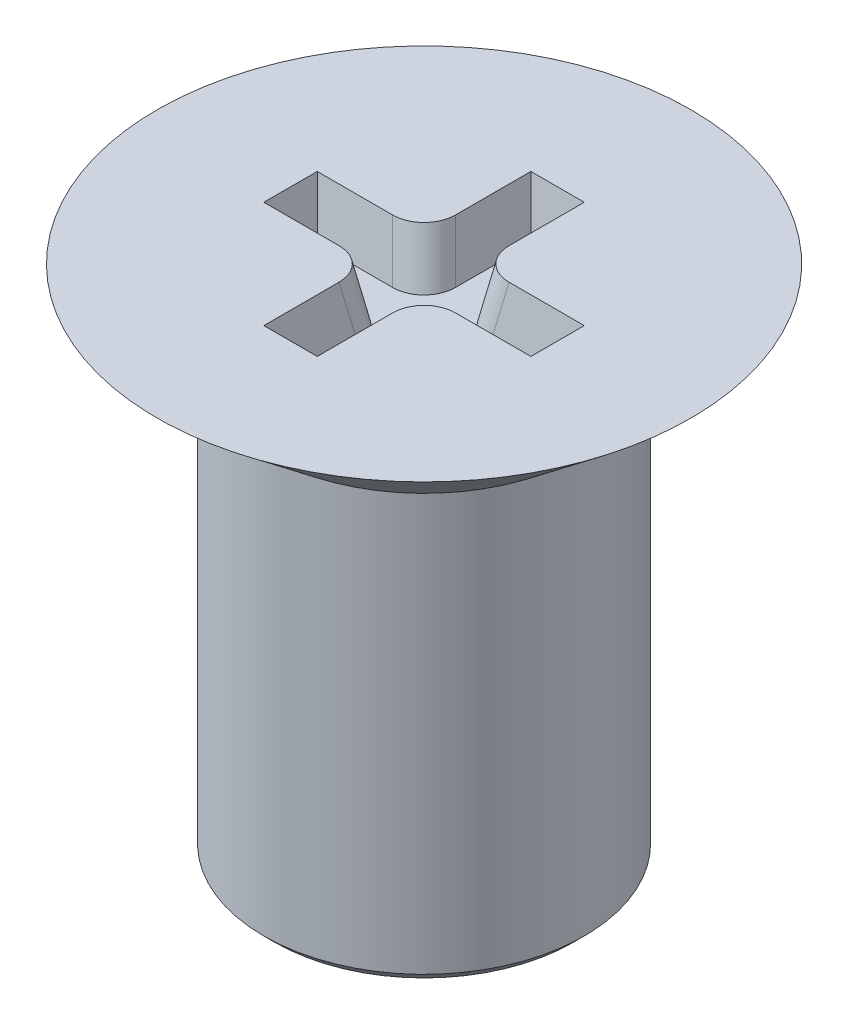
ISO-10303-21;
HEADER;
FILE_DESCRIPTION(('STEP AP214'),'2;1');
FILE_NAME('part.step','',(''),(''),'','','');
FILE_SCHEMA(('AUTOMOTIVE_DESIGN { 1 0 10303 214 1 1 1 1 }'));
ENDSEC;
DATA;
#1=APPLICATION_CONTEXT('core data for automotive mechanical design processes');
#2=APPLICATION_PROTOCOL_DEFINITION('international standard','automotive_design',2000,#1);
#3=PRODUCT_CONTEXT('',#1,'mechanical');
#4=PRODUCT('Part','Part','',(#3));
#5=PRODUCT_RELATED_PRODUCT_CATEGORY('part','',(#4));
#6=PRODUCT_DEFINITION_FORMATION('','',#4);
#7=PRODUCT_DEFINITION_CONTEXT('part definition',#1,'design');
#8=PRODUCT_DEFINITION('design','',#6,#7);
#9=PRODUCT_DEFINITION_SHAPE('','',#8);
#10=(LENGTH_UNIT() NAMED_UNIT(*) SI_UNIT(.MILLI.,.METRE.));
#11=(NAMED_UNIT(*) PLANE_ANGLE_UNIT() SI_UNIT($,.RADIAN.));
#12=(NAMED_UNIT(*) SI_UNIT($,.STERADIAN.) SOLID_ANGLE_UNIT());
#13=UNCERTAINTY_MEASURE_WITH_UNIT(LENGTH_MEASURE(1.E-05),#10,'distance_accuracy_value','');
#14=(GEOMETRIC_REPRESENTATION_CONTEXT(3) GLOBAL_UNCERTAINTY_ASSIGNED_CONTEXT((#13)) GLOBAL_UNIT_ASSIGNED_CONTEXT((#10,
#11,#12)) REPRESENTATION_CONTEXT('',''));
#15=CARTESIAN_POINT('',(0.,0.,0.));
#16=DIRECTION('',(0.,0.,1.));
#17=DIRECTION('',(1.,0.,0.));
#18=AXIS2_PLACEMENT_3D('',#15,#16,#17);
#19=CARTESIAN_POINT('',(0.,0.,0.));
#20=DIRECTION('',(0.,1.,0.));
#21=DIRECTION('',(0.,0.,1.));
#22=AXIS2_PLACEMENT_3D('',#19,#20,#21);
#23=PLANE('',#22);
#24=CARTESIAN_POINT('',(0.,0.,0.));
#25=DIRECTION('',(0.,-1.,0.));
#26=DIRECTION('',(0.,0.,-1.));
#27=AXIS2_PLACEMENT_3D('',#24,#25,#26);
#28=CIRCLE('',#27,2.5);
#29=CARTESIAN_POINT('',(0.,0.,-2.5));
#30=VERTEX_POINT('',#29);
#31=EDGE_CURVE('E254',#30,#30,#28,.T.);
#32=ORIENTED_EDGE('',*,*,#31,.F.);
#33=EDGE_LOOP('',(#32));
#34=FACE_BOUND('',#33,.T.);
#35=DIRECTION('',(1.,0.,0.));
#36=VECTOR('',#35,1.);
#37=CARTESIAN_POINT('',(0.,0.,-0.25));
#38=LINE('',#37,#36);
#39=CARTESIAN_POINT('',(-1.25,0.,-0.25));
#40=VERTEX_POINT('',#39);
#41=CARTESIAN_POINT('',(-0.545442325903662,0.,-0.25));
#42=VERTEX_POINT('',#41);
#43=EDGE_CURVE('E184',#40,#42,#38,.T.);
#44=ORIENTED_EDGE('',*,*,#43,.T.);
#45=CARTESIAN_POINT('',(-0.554627983565723,0.,-0.554627983565723));
#46=DIRECTION('',(0.,1.,0.));
#47=DIRECTION('',(-0.707106781186548,0.,-0.707106781186547));
#48=AXIS2_PLACEMENT_3D('',#45,#46,#47);
#49=ELLIPSE('',#48,0.309186702079241,0.3);
#50=CARTESIAN_POINT('',(-0.25,0.,-0.545442325903662));
#51=VERTEX_POINT('',#50);
#52=EDGE_CURVE('E272',#42,#51,#49,.T.);
#53=ORIENTED_EDGE('',*,*,#52,.T.);
#54=DIRECTION('',(0.,0.,1.));
#55=VECTOR('',#54,1.);
#56=CARTESIAN_POINT('',(-0.25,0.,0.));
#57=LINE('',#56,#55);
#58=CARTESIAN_POINT('',(-0.25,0.,-1.25));
#59=VERTEX_POINT('',#58);
#60=EDGE_CURVE('E182',#59,#51,#57,.T.);
#61=ORIENTED_EDGE('',*,*,#60,.F.);
#62=DIRECTION('',(1.,0.,0.));
#63=VECTOR('',#62,1.);
#64=CARTESIAN_POINT('',(0.,0.,-1.25));
#65=LINE('',#64,#63);
#66=CARTESIAN_POINT('',(0.25,0.,-1.25));
#67=VERTEX_POINT('',#66);
#68=EDGE_CURVE('E161',#59,#67,#65,.T.);
#69=ORIENTED_EDGE('',*,*,#68,.T.);
#70=DIRECTION('',(0.,0.,1.));
#71=VECTOR('',#70,1.);
#72=CARTESIAN_POINT('',(0.25,0.,0.));
#73=LINE('',#72,#71);
#74=CARTESIAN_POINT('',(0.25,0.,-0.545442325903662));
#75=VERTEX_POINT('',#74);
#76=EDGE_CURVE('E173',#67,#75,#73,.T.);
#77=ORIENTED_EDGE('',*,*,#76,.T.);
#78=CARTESIAN_POINT('',(0.554627983565724,0.,-0.554627983565723));
#79=DIRECTION('',(0.,1.,0.));
#80=DIRECTION('',(0.707106781186547,0.,-0.707106781186548));
#81=AXIS2_PLACEMENT_3D('',#78,#79,#80);
#82=ELLIPSE('',#81,0.309186702079241,0.3);
#83=CARTESIAN_POINT('',(0.545442325903663,0.,-0.25));
#84=VERTEX_POINT('',#83);
#85=EDGE_CURVE('E270',#75,#84,#82,.T.);
#86=ORIENTED_EDGE('',*,*,#85,.T.);
#87=DIRECTION('',(1.,0.,0.));
#88=VECTOR('',#87,1.);
#89=CARTESIAN_POINT('',(0.,0.,-0.25));
#90=LINE('',#89,#88);
#91=CARTESIAN_POINT('',(1.25,0.,-0.25));
#92=VERTEX_POINT('',#91);
#93=EDGE_CURVE('E178',#84,#92,#90,.T.);
#94=ORIENTED_EDGE('',*,*,#93,.T.);
#95=DIRECTION('',(0.,0.,-1.));
#96=VECTOR('',#95,1.);
#97=CARTESIAN_POINT('',(1.25,0.,0.));
#98=LINE('',#97,#96);
#99=CARTESIAN_POINT('',(1.25,0.,0.25));
#100=VERTEX_POINT('',#99);
#101=EDGE_CURVE('E204',#100,#92,#98,.T.);
#102=ORIENTED_EDGE('',*,*,#101,.F.);
#103=DIRECTION('',(1.,0.,0.));
#104=VECTOR('',#103,1.);
#105=CARTESIAN_POINT('',(0.,0.,0.25));
#106=LINE('',#105,#104);
#107=CARTESIAN_POINT('',(0.545442325903663,0.,0.25));
#108=VERTEX_POINT('',#107);
#109=EDGE_CURVE('E202',#108,#100,#106,.T.);
#110=ORIENTED_EDGE('',*,*,#109,.F.);
#111=CARTESIAN_POINT('',(0.554627983565724,0.,0.554627983565724));
#112=DIRECTION('',(0.,1.,0.));
#113=DIRECTION('',(0.707106781186548,0.,0.707106781186547));
#114=AXIS2_PLACEMENT_3D('',#111,#112,#113);
#115=ELLIPSE('',#114,0.309186702079241,0.3);
#116=CARTESIAN_POINT('',(0.25,0.,0.545442325903663));
#117=VERTEX_POINT('',#116);
#118=EDGE_CURVE('E266',#108,#117,#115,.T.);
#119=ORIENTED_EDGE('',*,*,#118,.T.);
#120=DIRECTION('',(0.,0.,1.));
#121=VECTOR('',#120,1.);
#122=CARTESIAN_POINT('',(0.25,0.,0.));
#123=LINE('',#122,#121);
#124=CARTESIAN_POINT('',(0.250000000000001,0.,1.25));
#125=VERTEX_POINT('',#124);
#126=EDGE_CURVE('E200',#117,#125,#123,.T.);
#127=ORIENTED_EDGE('',*,*,#126,.T.);
#128=DIRECTION('',(1.,0.,0.));
#129=VECTOR('',#128,1.);
#130=CARTESIAN_POINT('',(0.,0.,1.25));
#131=LINE('',#130,#129);
#132=CARTESIAN_POINT('',(-0.249999999999999,0.,1.25));
#133=VERTEX_POINT('',#132);
#134=EDGE_CURVE('E197',#133,#125,#131,.T.);
#135=ORIENTED_EDGE('',*,*,#134,.F.);
#136=DIRECTION('',(0.,0.,1.));
#137=VECTOR('',#136,1.);
#138=CARTESIAN_POINT('',(-0.25,0.,0.));
#139=LINE('',#138,#137);
#140=CARTESIAN_POINT('',(-0.25,0.,0.545442325903662));
#141=VERTEX_POINT('',#140);
#142=EDGE_CURVE('E195',#141,#133,#139,.T.);
#143=ORIENTED_EDGE('',*,*,#142,.F.);
#144=CARTESIAN_POINT('',(-0.554627983565723,0.,0.554627983565724));
#145=DIRECTION('',(0.,1.,0.));
#146=DIRECTION('',(-0.707106781186547,0.,0.707106781186548));
#147=AXIS2_PLACEMENT_3D('',#144,#145,#146);
#148=ELLIPSE('',#147,0.309186702079241,0.3);
#149=CARTESIAN_POINT('',(-0.545442325903662,0.,0.25));
#150=VERTEX_POINT('',#149);
#151=EDGE_CURVE('E268',#141,#150,#148,.T.);
#152=ORIENTED_EDGE('',*,*,#151,.T.);
#153=DIRECTION('',(1.,0.,0.));
#154=VECTOR('',#153,1.);
#155=CARTESIAN_POINT('',(0.,0.,0.25));
#156=LINE('',#155,#154);
#157=CARTESIAN_POINT('',(-1.25,0.,0.25));
#158=VERTEX_POINT('',#157);
#159=EDGE_CURVE('E192',#158,#150,#156,.T.);
#160=ORIENTED_EDGE('',*,*,#159,.F.);
#161=DIRECTION('',(0.,0.,-1.));
#162=VECTOR('',#161,1.);
#163=CARTESIAN_POINT('',(-1.25,0.,0.));
#164=LINE('',#163,#162);
#165=EDGE_CURVE('E189',#158,#40,#164,.T.);
#166=ORIENTED_EDGE('',*,*,#165,.T.);
#167=EDGE_LOOP('',(#44,#53,#61,#69,#77,#86,#94,#102,#110,#119,#127,#135,#143,#152,#160,#166));
#168=FACE_BOUND('',#167,.T.);
#169=ADVANCED_FACE('F45',(#34,#168),#23,.T.);
#170=CARTESIAN_POINT('',(0.,-0.8,0.));
#171=DIRECTION('',(0.,1.,0.));
#172=DIRECTION('',(0.,0.,1.));
#173=AXIS2_PLACEMENT_3D('',#170,#171,#172);
#174=CONICAL_SURFACE('',#173,1.5,0.896055384571344);
#175=ORIENTED_EDGE('',*,*,#31,.T.);
#176=EDGE_LOOP('',(#175));
#177=FACE_BOUND('',#176,.T.);
#178=CARTESIAN_POINT('',(0.,-0.8,0.));
#179=DIRECTION('',(0.,-1.,0.));
#180=DIRECTION('',(0.,0.,-1.));
#181=AXIS2_PLACEMENT_3D('',#178,#179,#180);
#182=CIRCLE('',#181,1.5);
#183=CARTESIAN_POINT('',(0.,-0.8,-1.5));
#184=VERTEX_POINT('',#183);
#185=EDGE_CURVE('E210',#184,#184,#182,.T.);
#186=ORIENTED_EDGE('',*,*,#185,.F.);
#187=EDGE_LOOP('',(#186));
#188=FACE_BOUND('',#187,.T.);
#189=ADVANCED_FACE('F349',(#177,#188),#174,.T.);
#190=CARTESIAN_POINT('',(0.,-4.8,0.));
#191=DIRECTION('',(0.,1.,0.));
#192=DIRECTION('',(0.,0.,1.));
#193=AXIS2_PLACEMENT_3D('',#190,#191,#192);
#194=CYLINDRICAL_SURFACE('',#193,1.5);
#195=CARTESIAN_POINT('',(0.,-4.7,0.));
#196=DIRECTION('',(0.,-1.,0.));
#197=DIRECTION('',(0.,0.,-1.));
#198=AXIS2_PLACEMENT_3D('',#195,#196,#197);
#199=CIRCLE('',#198,1.5);
#200=CARTESIAN_POINT('',(0.,-4.7,-1.5));
#201=VERTEX_POINT('',#200);
#202=EDGE_CURVE('E260',#201,#201,#199,.F.);
#203=ORIENTED_EDGE('',*,*,#202,.T.);
#204=EDGE_LOOP('',(#203));
#205=FACE_BOUND('',#204,.T.);
#206=ORIENTED_EDGE('',*,*,#185,.T.);
#207=EDGE_LOOP('',(#206));
#208=FACE_BOUND('',#207,.T.);
#209=ADVANCED_FACE('F357',(#205,#208),#194,.T.);
#210=CARTESIAN_POINT('',(0.,-4.8,0.));
#211=DIRECTION('',(0.,-1.,0.));
#212=DIRECTION('',(0.,0.,-1.));
#213=AXIS2_PLACEMENT_3D('',#210,#211,#212);
#214=PLANE('',#213);
#215=CARTESIAN_POINT('',(0.,-4.8,0.));
#216=DIRECTION('',(0.,-1.,0.));
#217=DIRECTION('',(0.,0.,-1.));
#218=AXIS2_PLACEMENT_3D('',#215,#216,#217);
#219=CIRCLE('',#218,1.4);
#220=CARTESIAN_POINT('',(0.,-4.8,-1.4));
#221=VERTEX_POINT('',#220);
#222=EDGE_CURVE('E257',#221,#221,#219,.T.);
#223=ORIENTED_EDGE('',*,*,#222,.T.);
#224=EDGE_LOOP('',(#223));
#225=FACE_BOUND('',#224,.T.);
#226=ADVANCED_FACE('F369',(#225),#214,.T.);
#227=CARTESIAN_POINT('',(0.,-4.8,0.));
#228=DIRECTION('',(0.,1.,0.));
#229=DIRECTION('',(0.,0.,1.));
#230=AXIS2_PLACEMENT_3D('',#227,#228,#229);
#231=CONICAL_SURFACE('',#230,1.4,0.785398163397448);
#232=ORIENTED_EDGE('',*,*,#202,.F.);
#233=EDGE_LOOP('',(#232));
#234=FACE_BOUND('',#233,.T.);
#235=ORIENTED_EDGE('',*,*,#222,.F.);
#236=EDGE_LOOP('',(#235));
#237=FACE_BOUND('',#236,.T.);
#238=ADVANCED_FACE('F364',(#234,#237),#231,.T.);
#239=CARTESIAN_POINT('',(0.,0.,-0.25));
#240=DIRECTION('',(0.,-0.17364817766693,-0.984807753012208));
#241=DIRECTION('',(0.,0.984807753012208,-0.17364817766693));
#242=AXIS2_PLACEMENT_3D('',#239,#240,#241);
#243=PLANE('',#242);
#244=ORIENTED_EDGE('',*,*,#93,.F.);
#245=DIRECTION('',(-0.171087869746036,-0.970287525247814,0.171087869746036));
#246=VECTOR('',#245,1.);
#247=CARTESIAN_POINT('',(0.529476651306003,-0.0905458400836372,-0.234034325402341));
#248=LINE('',#247,#246);
#249=CARTESIAN_POINT('',(0.45727883554943,-0.5,-0.161836509645767));
#250=VERTEX_POINT('',#249);
#251=EDGE_CURVE('E277',#84,#250,#248,.T.);
#252=ORIENTED_EDGE('',*,*,#251,.T.);
#253=DIRECTION('',(-1.,0.,0.));
#254=VECTOR('',#253,1.);
#255=CARTESIAN_POINT('',(0.,-0.5,-0.161836509645767));
#256=LINE('',#255,#254);
#257=CARTESIAN_POINT('',(1.16183650964577,-0.5,-0.161836509645767));
#258=VERTEX_POINT('',#257);
#259=EDGE_CURVE('E207',#250,#258,#256,.F.);
#260=ORIENTED_EDGE('',*,*,#259,.T.);
#261=DIRECTION('',(-0.171087869746036,-0.970287525247814,0.171087869746036));
#262=VECTOR('',#261,1.);
#263=CARTESIAN_POINT('',(1.2134111760322,-0.207505532169751,-0.213411176032204));
#264=LINE('',#263,#262);
#265=EDGE_CURVE('E208',#258,#92,#264,.F.);
#266=ORIENTED_EDGE('',*,*,#265,.T.);
#267=EDGE_LOOP('',(#244,#252,#260,#266));
#268=FACE_BOUND('',#267,.T.);
#269=ADVANCED_FACE('F333',(#268),#243,.F.);
#270=CARTESIAN_POINT('',(1.25,0.,0.));
#271=DIRECTION('',(0.984807753012208,-0.17364817766693,0.));
#272=DIRECTION('',(0.17364817766693,0.984807753012208,0.));
#273=AXIS2_PLACEMENT_3D('',#270,#271,#272);
#274=PLANE('',#273);
#275=ORIENTED_EDGE('',*,*,#101,.T.);
#276=ORIENTED_EDGE('',*,*,#265,.F.);
#277=DIRECTION('',(0.,0.,-1.));
#278=VECTOR('',#277,1.);
#279=CARTESIAN_POINT('',(1.16183650964577,-0.5,0.));
#280=LINE('',#279,#278);
#281=CARTESIAN_POINT('',(1.16183650964577,-0.5,0.161836509645768));
#282=VERTEX_POINT('',#281);
#283=EDGE_CURVE('E169',#282,#258,#280,.T.);
#284=ORIENTED_EDGE('',*,*,#283,.F.);
#285=DIRECTION('',(0.171087869746036,0.970287525247814,0.171087869746036));
#286=VECTOR('',#285,1.);
#287=CARTESIAN_POINT('',(1.2134111760322,-0.207505532169751,0.213411176032205));
#288=LINE('',#287,#286);
#289=EDGE_CURVE('E211',#282,#100,#288,.T.);
#290=ORIENTED_EDGE('',*,*,#289,.T.);
#291=EDGE_LOOP('',(#275,#276,#284,#290));
#292=FACE_BOUND('',#291,.T.);
#293=ADVANCED_FACE('F337',(#292),#274,.F.);
#294=CARTESIAN_POINT('',(0.,0.,0.25));
#295=DIRECTION('',(0.,-0.17364817766693,0.984807753012208));
#296=DIRECTION('',(0.,-0.984807753012208,-0.17364817766693));
#297=AXIS2_PLACEMENT_3D('',#294,#295,#296);
#298=PLANE('',#297);
#299=DIRECTION('',(1.,0.,0.));
#300=VECTOR('',#299,1.);
#301=CARTESIAN_POINT('',(0.,-0.5,0.161836509645768));
#302=LINE('',#301,#300);
#303=CARTESIAN_POINT('',(0.45727883554943,-0.5,0.161836509645768));
#304=VERTEX_POINT('',#303);
#305=EDGE_CURVE('E230',#304,#282,#302,.T.);
#306=ORIENTED_EDGE('',*,*,#305,.F.);
#307=DIRECTION('',(-0.171087869746036,-0.970287525247814,-0.171087869746036));
#308=VECTOR('',#307,1.);
#309=CARTESIAN_POINT('',(0.536794416099563,-0.049044733649687,0.2413520901959));
#310=LINE('',#309,#308);
#311=EDGE_CURVE('E284',#304,#108,#310,.F.);
#312=ORIENTED_EDGE('',*,*,#311,.T.);
#313=ORIENTED_EDGE('',*,*,#109,.T.);
#314=ORIENTED_EDGE('',*,*,#289,.F.);
#315=EDGE_LOOP('',(#306,#312,#313,#314));
#316=FACE_BOUND('',#315,.T.);
#317=ADVANCED_FACE('F341',(#316),#298,.F.);
#318=CARTESIAN_POINT('',(0.25,0.,0.));
#319=DIRECTION('',(0.984807753012208,-0.17364817766693,0.));
#320=DIRECTION('',(0.17364817766693,0.984807753012208,0.));
#321=AXIS2_PLACEMENT_3D('',#318,#319,#320);
#322=PLANE('',#321);
#323=ORIENTED_EDGE('',*,*,#126,.F.);
#324=DIRECTION('',(0.171087869746036,0.970287525247814,0.171087869746036));
#325=VECTOR('',#324,1.);
#326=CARTESIAN_POINT('',(0.153188599841668,-0.549044733649687,0.44863092574533));
#327=LINE('',#326,#325);
#328=CARTESIAN_POINT('',(0.161836509645768,-0.5,0.45727883554943));
#329=VERTEX_POINT('',#328);
#330=EDGE_CURVE('E60',#117,#329,#327,.F.);
#331=ORIENTED_EDGE('',*,*,#330,.T.);
#332=DIRECTION('',(0.,0.,-1.));
#333=VECTOR('',#332,1.);
#334=CARTESIAN_POINT('',(0.161836509645768,-0.5,0.));
#335=LINE('',#334,#333);
#336=CARTESIAN_POINT('',(0.161836509645768,-0.5,1.16183650964577));
#337=VERTEX_POINT('',#336);
#338=EDGE_CURVE('E232',#329,#337,#335,.F.);
#339=ORIENTED_EDGE('',*,*,#338,.T.);
#340=DIRECTION('',(-0.171087869746036,-0.970287525247814,-0.171087869746036));
#341=VECTOR('',#340,1.);
#342=CARTESIAN_POINT('',(0.213411176032205,-0.207505532169751,1.2134111760322));
#343=LINE('',#342,#341);
#344=EDGE_CURVE('E221',#337,#125,#343,.F.);
#345=ORIENTED_EDGE('',*,*,#344,.T.);
#346=EDGE_LOOP('',(#323,#331,#339,#345));
#347=FACE_BOUND('',#346,.T.);
#348=ADVANCED_FACE('F459',(#347),#322,.F.);
#349=CARTESIAN_POINT('',(0.,0.,1.25));
#350=DIRECTION('',(0.,-0.17364817766693,0.984807753012208));
#351=DIRECTION('',(0.,-0.984807753012208,-0.17364817766693));
#352=AXIS2_PLACEMENT_3D('',#349,#350,#351);
#353=PLANE('',#352);
#354=ORIENTED_EDGE('',*,*,#134,.T.);
#355=ORIENTED_EDGE('',*,*,#344,.F.);
#356=DIRECTION('',(1.,0.,0.));
#357=VECTOR('',#356,1.);
#358=CARTESIAN_POINT('',(0.,-0.5,1.16183650964577));
#359=LINE('',#358,#357);
#360=CARTESIAN_POINT('',(-0.161836509645767,-0.5,1.16183650964577));
#361=VERTEX_POINT('',#360);
#362=EDGE_CURVE('E234',#361,#337,#359,.T.);
#363=ORIENTED_EDGE('',*,*,#362,.F.);
#364=DIRECTION('',(-0.171087869746036,0.970287525247814,0.171087869746036));
#365=VECTOR('',#364,1.);
#366=CARTESIAN_POINT('',(-0.213411176032204,-0.207505532169751,1.2134111760322));
#367=LINE('',#366,#365);
#368=EDGE_CURVE('E218',#361,#133,#367,.T.);
#369=ORIENTED_EDGE('',*,*,#368,.T.);
#370=EDGE_LOOP('',(#354,#355,#363,#369));
#371=FACE_BOUND('',#370,.T.);
#372=ADVANCED_FACE('F451',(#371),#353,.F.);
#373=CARTESIAN_POINT('',(-0.25,0.,0.));
#374=DIRECTION('',(-0.984807753012208,-0.17364817766693,0.));
#375=DIRECTION('',(0.17364817766693,-0.984807753012208,0.));
#376=AXIS2_PLACEMENT_3D('',#373,#374,#375);
#377=PLANE('',#376);
#378=DIRECTION('',(0.,0.,1.));
#379=VECTOR('',#378,1.);
#380=CARTESIAN_POINT('',(-0.161836509645767,-0.5,0.));
#381=LINE('',#380,#379);
#382=CARTESIAN_POINT('',(-0.161836509645767,-0.5,0.45727883554943));
#383=VERTEX_POINT('',#382);
#384=EDGE_CURVE('E237',#383,#361,#381,.T.);
#385=ORIENTED_EDGE('',*,*,#384,.F.);
#386=DIRECTION('',(-0.171087869746036,0.970287525247814,0.171087869746036));
#387=VECTOR('',#386,1.);
#388=CARTESIAN_POINT('',(-0.23403432540234,-0.0905458400836372,0.529476651306003));
#389=LINE('',#388,#387);
#390=EDGE_CURVE('E279',#383,#141,#389,.T.);
#391=ORIENTED_EDGE('',*,*,#390,.T.);
#392=ORIENTED_EDGE('',*,*,#142,.T.);
#393=ORIENTED_EDGE('',*,*,#368,.F.);
#394=EDGE_LOOP('',(#385,#391,#392,#393));
#395=FACE_BOUND('',#394,.T.);
#396=ADVANCED_FACE('F302',(#395),#377,.F.);
#397=CARTESIAN_POINT('',(0.,0.,0.25));
#398=DIRECTION('',(0.,-0.17364817766693,0.984807753012208));
#399=DIRECTION('',(0.,-0.984807753012208,-0.17364817766693));
#400=AXIS2_PLACEMENT_3D('',#397,#398,#399);
#401=PLANE('',#400);
#402=ORIENTED_EDGE('',*,*,#159,.T.);
#403=DIRECTION('',(-0.171087869746036,0.970287525247814,0.171087869746036));
#404=VECTOR('',#403,1.);
#405=CARTESIAN_POINT('',(-0.529476651306003,-0.0905458400836371,0.234034325402341));
#406=LINE('',#405,#404);
#407=CARTESIAN_POINT('',(-0.457278835549429,-0.5,0.161836509645768));
#408=VERTEX_POINT('',#407);
#409=EDGE_CURVE('E282',#150,#408,#406,.F.);
#410=ORIENTED_EDGE('',*,*,#409,.T.);
#411=DIRECTION('',(1.,0.,0.));
#412=VECTOR('',#411,1.);
#413=CARTESIAN_POINT('',(0.,-0.5,0.161836509645768));
#414=LINE('',#413,#412);
#415=CARTESIAN_POINT('',(-1.16183650964577,-0.5,0.161836509645768));
#416=VERTEX_POINT('',#415);
#417=EDGE_CURVE('E239',#416,#408,#414,.T.);
#418=ORIENTED_EDGE('',*,*,#417,.F.);
#419=DIRECTION('',(0.171087869746036,-0.970287525247814,-0.171087869746036));
#420=VECTOR('',#419,1.);
#421=CARTESIAN_POINT('',(-1.2134111760322,-0.207505532169751,0.213411176032205));
#422=LINE('',#421,#420);
#423=EDGE_CURVE('E216',#416,#158,#422,.F.);
#424=ORIENTED_EDGE('',*,*,#423,.T.);
#425=EDGE_LOOP('',(#402,#410,#418,#424));
#426=FACE_BOUND('',#425,.T.);
#427=ADVANCED_FACE('F309',(#426),#401,.F.);
#428=CARTESIAN_POINT('',(-1.25,0.,0.));
#429=DIRECTION('',(-0.984807753012208,-0.17364817766693,0.));
#430=DIRECTION('',(0.17364817766693,-0.984807753012208,0.));
#431=AXIS2_PLACEMENT_3D('',#428,#429,#430);
#432=PLANE('',#431);
#433=ORIENTED_EDGE('',*,*,#165,.F.);
#434=ORIENTED_EDGE('',*,*,#423,.F.);
#435=DIRECTION('',(0.,0.,1.));
#436=VECTOR('',#435,1.);
#437=CARTESIAN_POINT('',(-1.16183650964577,-0.5,0.));
#438=LINE('',#437,#436);
#439=CARTESIAN_POINT('',(-1.16183650964577,-0.5,-0.161836509645767));
#440=VERTEX_POINT('',#439);
#441=EDGE_CURVE('E242',#416,#440,#438,.F.);
#442=ORIENTED_EDGE('',*,*,#441,.T.);
#443=DIRECTION('',(-0.171087869746036,0.970287525247814,-0.171087869746036));
#444=VECTOR('',#443,1.);
#445=CARTESIAN_POINT('',(-1.2134111760322,-0.207505532169751,-0.213411176032204));
#446=LINE('',#445,#444);
#447=EDGE_CURVE('E214',#440,#40,#446,.T.);
#448=ORIENTED_EDGE('',*,*,#447,.T.);
#449=EDGE_LOOP('',(#433,#434,#442,#448));
#450=FACE_BOUND('',#449,.T.);
#451=ADVANCED_FACE('F312',(#450),#432,.F.);
#452=CARTESIAN_POINT('',(0.,0.,-0.25));
#453=DIRECTION('',(0.,-0.17364817766693,-0.984807753012208));
#454=DIRECTION('',(0.,0.984807753012208,-0.17364817766693));
#455=AXIS2_PLACEMENT_3D('',#452,#453,#454);
#456=PLANE('',#455);
#457=DIRECTION('',(-1.,0.,0.));
#458=VECTOR('',#457,1.);
#459=CARTESIAN_POINT('',(0.,-0.5,-0.161836509645767));
#460=LINE('',#459,#458);
#461=CARTESIAN_POINT('',(-0.457278835549429,-0.5,-0.161836509645767));
#462=VERTEX_POINT('',#461);
#463=EDGE_CURVE('E244',#440,#462,#460,.F.);
#464=ORIENTED_EDGE('',*,*,#463,.T.);
#465=DIRECTION('',(-0.171087869746036,0.970287525247814,-0.171087869746036));
#466=VECTOR('',#465,1.);
#467=CARTESIAN_POINT('',(-0.536794416099562,-0.0490447336496869,-0.2413520901959));
#468=LINE('',#467,#466);
#469=EDGE_CURVE('E263',#462,#42,#468,.T.);
#470=ORIENTED_EDGE('',*,*,#469,.T.);
#471=ORIENTED_EDGE('',*,*,#43,.F.);
#472=ORIENTED_EDGE('',*,*,#447,.F.);
#473=EDGE_LOOP('',(#464,#470,#471,#472));
#474=FACE_BOUND('',#473,.T.);
#475=ADVANCED_FACE('F316',(#474),#456,.F.);
#476=CARTESIAN_POINT('',(-0.25,0.,0.));
#477=DIRECTION('',(-0.984807753012208,-0.17364817766693,0.));
#478=DIRECTION('',(0.17364817766693,-0.984807753012208,0.));
#479=AXIS2_PLACEMENT_3D('',#476,#477,#478);
#480=PLANE('',#479);
#481=ORIENTED_EDGE('',*,*,#60,.T.);
#482=DIRECTION('',(0.171087869746036,-0.970287525247814,0.171087869746036));
#483=VECTOR('',#482,1.);
#484=CARTESIAN_POINT('',(-0.153188599841667,-0.549044733649687,-0.44863092574533));
#485=LINE('',#484,#483);
#486=CARTESIAN_POINT('',(-0.161836509645767,-0.5,-0.45727883554943));
#487=VERTEX_POINT('',#486);
#488=EDGE_CURVE('E274',#51,#487,#485,.T.);
#489=ORIENTED_EDGE('',*,*,#488,.T.);
#490=DIRECTION('',(0.,0.,1.));
#491=VECTOR('',#490,1.);
#492=CARTESIAN_POINT('',(-0.161836509645767,-0.5,0.));
#493=LINE('',#492,#491);
#494=CARTESIAN_POINT('',(-0.161836509645767,-0.5,-1.16183650964577));
#495=VERTEX_POINT('',#494);
#496=EDGE_CURVE('E247',#495,#487,#493,.T.);
#497=ORIENTED_EDGE('',*,*,#496,.F.);
#498=DIRECTION('',(0.171087869746036,-0.970287525247814,0.171087869746036));
#499=VECTOR('',#498,1.);
#500=CARTESIAN_POINT('',(-0.213411176032204,-0.207505532169751,-1.2134111760322));
#501=LINE('',#500,#499);
#502=EDGE_CURVE('E168',#495,#59,#501,.F.);
#503=ORIENTED_EDGE('',*,*,#502,.T.);
#504=EDGE_LOOP('',(#481,#489,#497,#503));
#505=FACE_BOUND('',#504,.T.);
#506=ADVANCED_FACE('F325',(#505),#480,.F.);
#507=CARTESIAN_POINT('',(0.,0.,-1.25));
#508=DIRECTION('',(0.,-0.17364817766693,-0.984807753012208));
#509=DIRECTION('',(0.,0.984807753012208,-0.17364817766693));
#510=AXIS2_PLACEMENT_3D('',#507,#508,#509);
#511=PLANE('',#510);
#512=ORIENTED_EDGE('',*,*,#68,.F.);
#513=ORIENTED_EDGE('',*,*,#502,.F.);
#514=DIRECTION('',(-1.,0.,0.));
#515=VECTOR('',#514,1.);
#516=CARTESIAN_POINT('',(0.,-0.5,-1.16183650964577));
#517=LINE('',#516,#515);
#518=CARTESIAN_POINT('',(0.161836509645768,-0.5,-1.16183650964577));
#519=VERTEX_POINT('',#518);
#520=EDGE_CURVE('E164',#495,#519,#517,.F.);
#521=ORIENTED_EDGE('',*,*,#520,.T.);
#522=DIRECTION('',(0.171087869746036,0.970287525247814,-0.171087869746036));
#523=VECTOR('',#522,1.);
#524=CARTESIAN_POINT('',(0.213411176032205,-0.207505532169751,-1.2134111760322));
#525=LINE('',#524,#523);
#526=EDGE_CURVE('E157',#519,#67,#525,.T.);
#527=ORIENTED_EDGE('',*,*,#526,.T.);
#528=EDGE_LOOP('',(#512,#513,#521,#527));
#529=FACE_BOUND('',#528,.T.);
#530=ADVANCED_FACE('F159',(#529),#511,.F.);
#531=CARTESIAN_POINT('',(0.25,0.,0.));
#532=DIRECTION('',(0.984807753012208,-0.17364817766693,0.));
#533=DIRECTION('',(0.17364817766693,0.984807753012208,0.));
#534=AXIS2_PLACEMENT_3D('',#531,#532,#533);
#535=PLANE('',#534);
#536=DIRECTION('',(0.,0.,-1.));
#537=VECTOR('',#536,1.);
#538=CARTESIAN_POINT('',(0.161836509645768,-0.5,0.));
#539=LINE('',#538,#537);
#540=CARTESIAN_POINT('',(0.161836509645768,-0.5,-0.45727883554943));
#541=VERTEX_POINT('',#540);
#542=EDGE_CURVE('E227',#519,#541,#539,.F.);
#543=ORIENTED_EDGE('',*,*,#542,.T.);
#544=DIRECTION('',(-0.171087869746036,-0.970287525247814,0.171087869746036));
#545=VECTOR('',#544,1.);
#546=CARTESIAN_POINT('',(0.234034325402341,-0.0905458400836371,-0.529476651306003));
#547=LINE('',#546,#545);
#548=EDGE_CURVE('E176',#541,#75,#547,.F.);
#549=ORIENTED_EDGE('',*,*,#548,.T.);
#550=ORIENTED_EDGE('',*,*,#76,.F.);
#551=ORIENTED_EDGE('',*,*,#526,.F.);
#552=EDGE_LOOP('',(#543,#549,#550,#551));
#553=FACE_BOUND('',#552,.T.);
#554=ADVANCED_FACE('F174',(#553),#535,.F.);
#555=CARTESIAN_POINT('',(0.,-0.5,0.));
#556=DIRECTION('',(0.,1.,0.));
#557=DIRECTION('',(0.,0.,1.));
#558=AXIS2_PLACEMENT_3D('',#555,#556,#557);
#559=PLANE('',#558);
#560=ORIENTED_EDGE('',*,*,#259,.F.);
#561=CARTESIAN_POINT('',(0.466464493211491,-0.5,-0.466464493211491));
#562=DIRECTION('',(0.,1.,0.));
#563=DIRECTION('',(0.707106781186547,0.,-0.707106781186548));
#564=AXIS2_PLACEMENT_3D('',#561,#562,#563);
#565=ELLIPSE('',#564,0.309186702079241,0.3);
#566=EDGE_CURVE('E290',#250,#541,#565,.F.);
#567=ORIENTED_EDGE('',*,*,#566,.T.);
#568=ORIENTED_EDGE('',*,*,#542,.F.);
#569=ORIENTED_EDGE('',*,*,#520,.F.);
#570=ORIENTED_EDGE('',*,*,#496,.T.);
#571=CARTESIAN_POINT('',(-0.466464493211491,-0.5,-0.466464493211491));
#572=DIRECTION('',(0.,1.,0.));
#573=DIRECTION('',(-0.707106781186548,0.,-0.707106781186547));
#574=AXIS2_PLACEMENT_3D('',#571,#572,#573);
#575=ELLIPSE('',#574,0.309186702079241,0.3);
#576=EDGE_CURVE('E288',#487,#462,#575,.F.);
#577=ORIENTED_EDGE('',*,*,#576,.T.);
#578=ORIENTED_EDGE('',*,*,#463,.F.);
#579=ORIENTED_EDGE('',*,*,#441,.F.);
#580=ORIENTED_EDGE('',*,*,#417,.T.);
#581=CARTESIAN_POINT('',(-0.46646449321149,-0.5,0.466464493211491));
#582=DIRECTION('',(0.,1.,0.));
#583=DIRECTION('',(-0.707106781186547,0.,0.707106781186548));
#584=AXIS2_PLACEMENT_3D('',#581,#582,#583);
#585=ELLIPSE('',#584,0.309186702079241,0.3);
#586=EDGE_CURVE('E53',#408,#383,#585,.F.);
#587=ORIENTED_EDGE('',*,*,#586,.T.);
#588=ORIENTED_EDGE('',*,*,#384,.T.);
#589=ORIENTED_EDGE('',*,*,#362,.T.);
#590=ORIENTED_EDGE('',*,*,#338,.F.);
#591=CARTESIAN_POINT('',(0.466464493211491,-0.5,0.466464493211491));
#592=DIRECTION('',(0.,1.,0.));
#593=DIRECTION('',(0.707106781186548,0.,0.707106781186547));
#594=AXIS2_PLACEMENT_3D('',#591,#592,#593);
#595=ELLIPSE('',#594,0.309186702079241,0.3);
#596=EDGE_CURVE('E11',#329,#304,#595,.F.);
#597=ORIENTED_EDGE('',*,*,#596,.T.);
#598=ORIENTED_EDGE('',*,*,#305,.T.);
#599=ORIENTED_EDGE('',*,*,#283,.T.);
#600=EDGE_LOOP('',(#560,#567,#568,#569,#570,#577,#578,#579,#580,#587,#588,#589,#590,#597,#598,#599));
#601=FACE_BOUND('',#600,.T.);
#602=ADVANCED_FACE('F294',(#601),#559,.T.);
#603=CARTESIAN_POINT('',(-0.529476651306003,-0.142640293383716,-0.529476651306003));
#604=DIRECTION('',(-0.171087869746036,0.970287525247814,-0.171087869746036));
#605=DIRECTION('',(-0.984807753012208,-0.17364817766693,0.));
#606=AXIS2_PLACEMENT_3D('',#603,#604,#605);
#607=CYLINDRICAL_SURFACE('',#606,0.3);
#608=ORIENTED_EDGE('',*,*,#576,.F.);
#609=ORIENTED_EDGE('',*,*,#488,.F.);
#610=ORIENTED_EDGE('',*,*,#52,.F.);
#611=ORIENTED_EDGE('',*,*,#469,.F.);
#612=EDGE_LOOP('',(#608,#609,#610,#611));
#613=FACE_BOUND('',#612,.T.);
#614=ADVANCED_FACE('F321',(#613),#607,.T.);
#615=CARTESIAN_POINT('',(0.529476651306003,-0.142640293383716,-0.529476651306003));
#616=DIRECTION('',(0.171087869746036,0.970287525247814,-0.171087869746036));
#617=DIRECTION('',(0.,0.17364817766693,0.984807753012208));
#618=AXIS2_PLACEMENT_3D('',#615,#616,#617);
#619=CYLINDRICAL_SURFACE('',#618,0.3);
#620=ORIENTED_EDGE('',*,*,#566,.F.);
#621=ORIENTED_EDGE('',*,*,#251,.F.);
#622=ORIENTED_EDGE('',*,*,#85,.F.);
#623=ORIENTED_EDGE('',*,*,#548,.F.);
#624=EDGE_LOOP('',(#620,#621,#622,#623));
#625=FACE_BOUND('',#624,.T.);
#626=ADVANCED_FACE('F328',(#625),#619,.T.);
#627=CARTESIAN_POINT('',(-0.529476651306003,-0.142640293383716,0.529476651306003));
#628=DIRECTION('',(-0.171087869746036,0.970287525247814,0.171087869746036));
#629=DIRECTION('',(0.,-0.17364817766693,0.984807753012208));
#630=AXIS2_PLACEMENT_3D('',#627,#628,#629);
#631=CYLINDRICAL_SURFACE('',#630,0.3);
#632=ORIENTED_EDGE('',*,*,#586,.F.);
#633=ORIENTED_EDGE('',*,*,#409,.F.);
#634=ORIENTED_EDGE('',*,*,#151,.F.);
#635=ORIENTED_EDGE('',*,*,#390,.F.);
#636=EDGE_LOOP('',(#632,#633,#634,#635));
#637=FACE_BOUND('',#636,.T.);
#638=ADVANCED_FACE('F305',(#637),#631,.T.);
#639=CARTESIAN_POINT('',(0.529476651306004,-0.142640293383716,0.529476651306003));
#640=DIRECTION('',(0.171087869746036,0.970287525247814,0.171087869746036));
#641=DIRECTION('',(-0.984807753012208,0.17364817766693,0.));
#642=AXIS2_PLACEMENT_3D('',#639,#640,#641);
#643=CYLINDRICAL_SURFACE('',#642,0.3);
#644=ORIENTED_EDGE('',*,*,#596,.F.);
#645=ORIENTED_EDGE('',*,*,#330,.F.);
#646=ORIENTED_EDGE('',*,*,#118,.F.);
#647=ORIENTED_EDGE('',*,*,#311,.F.);
#648=EDGE_LOOP('',(#644,#645,#646,#647));
#649=FACE_BOUND('',#648,.T.);
#650=ADVANCED_FACE('F47',(#649),#643,.T.);
#651=CLOSED_SHELL('',(#169,#189,#209,#226,#238,#269,#293,#317,#348,#372,#396,#427,#451,#475,
#506,#530,#554,#602,#614,#626,#638,#650));
#652=MANIFOLD_SOLID_BREP('B2',#651);
#653=ADVANCED_BREP_SHAPE_REPRESENTATION('',(#18,#652),#14);
#654=SHAPE_DEFINITION_REPRESENTATION(#9,#653);
ENDSEC;
END-ISO-10303-21;
